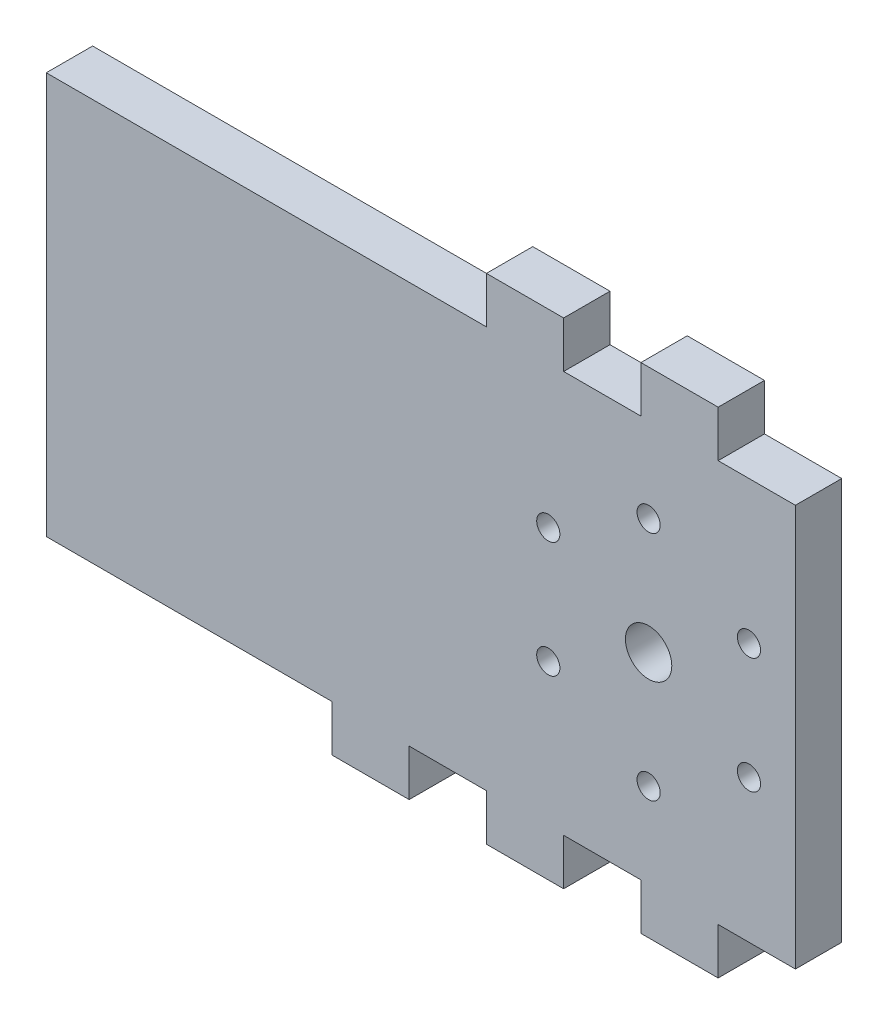
ISO-10303-21;
HEADER;
FILE_DESCRIPTION(('STEP AP214'),'2;1');
FILE_NAME('part.step','',(''),(''),'','','');
FILE_SCHEMA(('AUTOMOTIVE_DESIGN { 1 0 10303 214 1 1 1 1 }'));
ENDSEC;
DATA;
#1=APPLICATION_CONTEXT('core data for automotive mechanical design processes');
#2=APPLICATION_PROTOCOL_DEFINITION('international standard','automotive_design',2000,#1);
#3=PRODUCT_CONTEXT('',#1,'mechanical');
#4=PRODUCT('Part','Part','',(#3));
#5=PRODUCT_RELATED_PRODUCT_CATEGORY('part','',(#4));
#6=PRODUCT_DEFINITION_FORMATION('','',#4);
#7=PRODUCT_DEFINITION_CONTEXT('part definition',#1,'design');
#8=PRODUCT_DEFINITION('design','',#6,#7);
#9=PRODUCT_DEFINITION_SHAPE('','',#8);
#10=(LENGTH_UNIT() NAMED_UNIT(*) SI_UNIT(.MILLI.,.METRE.));
#11=(NAMED_UNIT(*) PLANE_ANGLE_UNIT() SI_UNIT($,.RADIAN.));
#12=(NAMED_UNIT(*) SI_UNIT($,.STERADIAN.) SOLID_ANGLE_UNIT());
#13=UNCERTAINTY_MEASURE_WITH_UNIT(LENGTH_MEASURE(1.E-05),#10,'distance_accuracy_value','');
#14=(GEOMETRIC_REPRESENTATION_CONTEXT(3) GLOBAL_UNCERTAINTY_ASSIGNED_CONTEXT((#13)) GLOBAL_UNIT_ASSIGNED_CONTEXT((#10,
#11,#12)) REPRESENTATION_CONTEXT('',''));
#15=CARTESIAN_POINT('',(0.,0.,0.));
#16=DIRECTION('',(0.,0.,1.));
#17=DIRECTION('',(1.,0.,0.));
#18=AXIS2_PLACEMENT_3D('',#15,#16,#17);
#19=CARTESIAN_POINT('',(0.,0.,3.));
#20=DIRECTION('',(0.,0.,-1.));
#21=DIRECTION('',(-1.,0.,0.));
#22=AXIS2_PLACEMENT_3D('',#19,#20,#21);
#23=PLANE('',#22);
#24=DIRECTION('',(1.,0.,0.));
#25=VECTOR('',#24,1.);
#26=CARTESIAN_POINT('',(25.,-26.,3.));
#27=LINE('',#26,#25);
#28=CARTESIAN_POINT('',(25.,-26.,3.));
#29=VERTEX_POINT('',#28);
#30=CARTESIAN_POINT('',(30.,-26.,3.));
#31=VERTEX_POINT('',#30);
#32=EDGE_CURVE('E274',#29,#31,#27,.T.);
#33=ORIENTED_EDGE('',*,*,#32,.T.);
#34=DIRECTION('',(0.,1.,0.));
#35=VECTOR('',#34,1.);
#36=CARTESIAN_POINT('',(30.,0.,3.));
#37=LINE('',#36,#35);
#38=CARTESIAN_POINT('',(30.,0.,3.));
#39=VERTEX_POINT('',#38);
#40=EDGE_CURVE('E141',#31,#39,#37,.T.);
#41=ORIENTED_EDGE('',*,*,#40,.T.);
#42=DIRECTION('',(-1.,0.,0.));
#43=VECTOR('',#42,1.);
#44=CARTESIAN_POINT('',(25.,0.,3.));
#45=LINE('',#44,#43);
#46=CARTESIAN_POINT('',(25.,0.,3.));
#47=VERTEX_POINT('',#46);
#48=EDGE_CURVE('E337',#39,#47,#45,.T.);
#49=ORIENTED_EDGE('',*,*,#48,.T.);
#50=DIRECTION('',(0.,1.,0.));
#51=VECTOR('',#50,1.);
#52=CARTESIAN_POINT('',(25.,2.99999999999994,3.));
#53=LINE('',#52,#51);
#54=CARTESIAN_POINT('',(25.,2.99999999999994,3.));
#55=VERTEX_POINT('',#54);
#56=EDGE_CURVE('E356',#47,#55,#53,.T.);
#57=ORIENTED_EDGE('',*,*,#56,.T.);
#58=DIRECTION('',(-1.,0.,0.));
#59=VECTOR('',#58,1.);
#60=CARTESIAN_POINT('',(20.,2.99999999999995,3.));
#61=LINE('',#60,#59);
#62=CARTESIAN_POINT('',(20.,2.99999999999995,3.));
#63=VERTEX_POINT('',#62);
#64=EDGE_CURVE('E353',#55,#63,#61,.T.);
#65=ORIENTED_EDGE('',*,*,#64,.T.);
#66=DIRECTION('',(0.,-1.,0.));
#67=VECTOR('',#66,1.);
#68=CARTESIAN_POINT('',(20.,0.,3.));
#69=LINE('',#68,#67);
#70=CARTESIAN_POINT('',(20.,0.,3.));
#71=VERTEX_POINT('',#70);
#72=EDGE_CURVE('E355',#63,#71,#69,.T.);
#73=ORIENTED_EDGE('',*,*,#72,.T.);
#74=DIRECTION('',(-1.,0.,0.));
#75=VECTOR('',#74,1.);
#76=CARTESIAN_POINT('',(14.9999999999999,0.,3.));
#77=LINE('',#76,#75);
#78=CARTESIAN_POINT('',(14.9999999999999,0.,3.));
#79=VERTEX_POINT('',#78);
#80=EDGE_CURVE('E358',#71,#79,#77,.T.);
#81=ORIENTED_EDGE('',*,*,#80,.T.);
#82=DIRECTION('',(0.,1.,0.));
#83=VECTOR('',#82,1.);
#84=CARTESIAN_POINT('',(14.9999999999999,2.99999999999994,3.));
#85=LINE('',#84,#83);
#86=CARTESIAN_POINT('',(14.9999999999999,2.99999999999994,3.));
#87=VERTEX_POINT('',#86);
#88=EDGE_CURVE('E364',#79,#87,#85,.T.);
#89=ORIENTED_EDGE('',*,*,#88,.T.);
#90=DIRECTION('',(-1.,0.,0.));
#91=VECTOR('',#90,1.);
#92=CARTESIAN_POINT('',(9.99999999999993,2.99999999999996,3.));
#93=LINE('',#92,#91);
#94=CARTESIAN_POINT('',(9.99999999999993,2.99999999999996,3.));
#95=VERTEX_POINT('',#94);
#96=EDGE_CURVE('E366',#87,#95,#93,.T.);
#97=ORIENTED_EDGE('',*,*,#96,.T.);
#98=DIRECTION('',(0.,-1.,0.));
#99=VECTOR('',#98,1.);
#100=CARTESIAN_POINT('',(9.99999999999994,0.,3.));
#101=LINE('',#100,#99);
#102=CARTESIAN_POINT('',(9.99999999999994,0.,3.));
#103=VERTEX_POINT('',#102);
#104=EDGE_CURVE('E368',#95,#103,#101,.T.);
#105=ORIENTED_EDGE('',*,*,#104,.T.);
#106=DIRECTION('',(-1.,0.,0.));
#107=VECTOR('',#106,1.);
#108=CARTESIAN_POINT('',(0.,0.,3.));
#109=LINE('',#108,#107);
#110=CARTESIAN_POINT('',(-18.49,-1.17961196366423E-13,3.));
#111=VERTEX_POINT('',#110);
#112=EDGE_CURVE('E370',#103,#111,#109,.T.);
#113=ORIENTED_EDGE('',*,*,#112,.T.);
#114=DIRECTION('',(0.,-1.,0.));
#115=VECTOR('',#114,1.);
#116=CARTESIAN_POINT('',(-18.49,-26.,3.));
#117=LINE('',#116,#115);
#118=CARTESIAN_POINT('',(-18.49,-26.,3.));
#119=VERTEX_POINT('',#118);
#120=EDGE_CURVE('E372',#111,#119,#117,.T.);
#121=ORIENTED_EDGE('',*,*,#120,.T.);
#122=DIRECTION('',(1.,0.,0.));
#123=VECTOR('',#122,1.);
#124=CARTESIAN_POINT('',(0.,-26.,3.));
#125=LINE('',#124,#123);
#126=CARTESIAN_POINT('',(0.,-26.,3.));
#127=VERTEX_POINT('',#126);
#128=EDGE_CURVE('E374',#119,#127,#125,.T.);
#129=ORIENTED_EDGE('',*,*,#128,.T.);
#130=DIRECTION('',(0.,-1.,0.));
#131=VECTOR('',#130,1.);
#132=CARTESIAN_POINT('',(0.,-26.,3.));
#133=LINE('',#132,#131);
#134=CARTESIAN_POINT('',(0.,-29.,3.));
#135=VERTEX_POINT('',#134);
#136=EDGE_CURVE('E376',#127,#135,#133,.T.);
#137=ORIENTED_EDGE('',*,*,#136,.T.);
#138=DIRECTION('',(1.,0.,0.));
#139=VECTOR('',#138,1.);
#140=CARTESIAN_POINT('',(0.,-29.,3.));
#141=LINE('',#140,#139);
#142=CARTESIAN_POINT('',(4.99999999999994,-29.,3.));
#143=VERTEX_POINT('',#142);
#144=EDGE_CURVE('E378',#135,#143,#141,.T.);
#145=ORIENTED_EDGE('',*,*,#144,.T.);
#146=DIRECTION('',(0.,1.,0.));
#147=VECTOR('',#146,1.);
#148=CARTESIAN_POINT('',(4.99999999999994,-29.,3.));
#149=LINE('',#148,#147);
#150=CARTESIAN_POINT('',(4.99999999999994,-26.,3.));
#151=VERTEX_POINT('',#150);
#152=EDGE_CURVE('E380',#143,#151,#149,.T.);
#153=ORIENTED_EDGE('',*,*,#152,.T.);
#154=DIRECTION('',(1.,0.,0.));
#155=VECTOR('',#154,1.);
#156=CARTESIAN_POINT('',(4.99999999999994,-26.,3.));
#157=LINE('',#156,#155);
#158=CARTESIAN_POINT('',(9.99999999999994,-26.,3.));
#159=VERTEX_POINT('',#158);
#160=EDGE_CURVE('E382',#151,#159,#157,.T.);
#161=ORIENTED_EDGE('',*,*,#160,.T.);
#162=DIRECTION('',(0.,-1.,0.));
#163=VECTOR('',#162,1.);
#164=CARTESIAN_POINT('',(9.99999999999994,-26.,3.));
#165=LINE('',#164,#163);
#166=CARTESIAN_POINT('',(9.99999999999995,-29.,3.));
#167=VERTEX_POINT('',#166);
#168=EDGE_CURVE('E384',#159,#167,#165,.T.);
#169=ORIENTED_EDGE('',*,*,#168,.T.);
#170=DIRECTION('',(1.,0.,0.));
#171=VECTOR('',#170,1.);
#172=CARTESIAN_POINT('',(9.99999999999995,-29.,3.));
#173=LINE('',#172,#171);
#174=CARTESIAN_POINT('',(14.9999999999999,-29.,3.));
#175=VERTEX_POINT('',#174);
#176=EDGE_CURVE('E386',#167,#175,#173,.T.);
#177=ORIENTED_EDGE('',*,*,#176,.T.);
#178=DIRECTION('',(0.,1.,0.));
#179=VECTOR('',#178,1.);
#180=CARTESIAN_POINT('',(14.9999999999999,-29.,3.));
#181=LINE('',#180,#179);
#182=CARTESIAN_POINT('',(15.,-26.,3.));
#183=VERTEX_POINT('',#182);
#184=EDGE_CURVE('E388',#175,#183,#181,.T.);
#185=ORIENTED_EDGE('',*,*,#184,.T.);
#186=DIRECTION('',(1.,0.,0.));
#187=VECTOR('',#186,1.);
#188=CARTESIAN_POINT('',(15.,-26.,3.));
#189=LINE('',#188,#187);
#190=CARTESIAN_POINT('',(20.,-26.,3.));
#191=VERTEX_POINT('',#190);
#192=EDGE_CURVE('E208',#183,#191,#189,.T.);
#193=ORIENTED_EDGE('',*,*,#192,.T.);
#194=DIRECTION('',(0.,-1.,0.));
#195=VECTOR('',#194,1.);
#196=CARTESIAN_POINT('',(20.,-29.,3.));
#197=LINE('',#196,#195);
#198=CARTESIAN_POINT('',(20.,-29.,3.));
#199=VERTEX_POINT('',#198);
#200=EDGE_CURVE('E202',#191,#199,#197,.T.);
#201=ORIENTED_EDGE('',*,*,#200,.T.);
#202=DIRECTION('',(1.,0.,0.));
#203=VECTOR('',#202,1.);
#204=CARTESIAN_POINT('',(20.,-29.,3.));
#205=LINE('',#204,#203);
#206=CARTESIAN_POINT('',(25.,-29.,3.));
#207=VERTEX_POINT('',#206);
#208=EDGE_CURVE('E206',#199,#207,#205,.T.);
#209=ORIENTED_EDGE('',*,*,#208,.T.);
#210=DIRECTION('',(0.,1.,0.));
#211=VECTOR('',#210,1.);
#212=CARTESIAN_POINT('',(25.,-29.,3.));
#213=LINE('',#212,#211);
#214=EDGE_CURVE('E50',#207,#29,#213,.T.);
#215=ORIENTED_EDGE('',*,*,#214,.T.);
#216=EDGE_LOOP('',(#33,#41,#49,#57,#65,#73,#81,#89,#97,#105,#113,#121,#129,#137,#145,#153,#161,
#169,#177,#185,#193,#201,#209,#215));
#217=FACE_BOUND('',#216,.T.);
#218=CARTESIAN_POINT('',(20.5,-5.50000000000007,3.));
#219=DIRECTION('',(0.,0.,1.));
#220=DIRECTION('',(1.,0.,0.));
#221=AXIS2_PLACEMENT_3D('',#218,#219,#220);
#222=CIRCLE('',#221,0.750000000000002);
#223=CARTESIAN_POINT('',(21.25,-5.50000000000007,3.));
#224=VERTEX_POINT('',#223);
#225=EDGE_CURVE('E230',#224,#224,#222,.T.);
#226=ORIENTED_EDGE('',*,*,#225,.F.);
#227=EDGE_LOOP('',(#226));
#228=FACE_BOUND('',#227,.T.);
#229=CARTESIAN_POINT('',(20.5,-13.0000000000001,3.));
#230=DIRECTION('',(0.,0.,1.));
#231=DIRECTION('',(1.,0.,0.));
#232=AXIS2_PLACEMENT_3D('',#229,#230,#231);
#233=CIRCLE('',#232,1.5);
#234=CARTESIAN_POINT('',(22.,-13.0000000000001,3.));
#235=VERTEX_POINT('',#234);
#236=EDGE_CURVE('E482',#235,#235,#233,.T.);
#237=ORIENTED_EDGE('',*,*,#236,.F.);
#238=EDGE_LOOP('',(#237));
#239=FACE_BOUND('',#238,.T.);
#240=CARTESIAN_POINT('',(26.9951905283833,-9.25000000000007,3.));
#241=DIRECTION('',(0.,0.,1.));
#242=DIRECTION('',(1.,0.,0.));
#243=AXIS2_PLACEMENT_3D('',#240,#241,#242);
#244=CIRCLE('',#243,0.750000000000002);
#245=CARTESIAN_POINT('',(27.7451905283833,-9.25000000000007,3.));
#246=VERTEX_POINT('',#245);
#247=EDGE_CURVE('E476',#246,#246,#244,.T.);
#248=ORIENTED_EDGE('',*,*,#247,.F.);
#249=EDGE_LOOP('',(#248));
#250=FACE_BOUND('',#249,.T.);
#251=CARTESIAN_POINT('',(26.9951905283833,-16.7500000000001,3.));
#252=DIRECTION('',(0.,0.,1.));
#253=DIRECTION('',(1.,0.,0.));
#254=AXIS2_PLACEMENT_3D('',#251,#252,#253);
#255=CIRCLE('',#254,0.750000000000005);
#256=CARTESIAN_POINT('',(27.7451905283833,-16.7500000000001,3.));
#257=VERTEX_POINT('',#256);
#258=EDGE_CURVE('E470',#257,#257,#255,.T.);
#259=ORIENTED_EDGE('',*,*,#258,.F.);
#260=EDGE_LOOP('',(#259));
#261=FACE_BOUND('',#260,.T.);
#262=CARTESIAN_POINT('',(20.5,-20.5000000000001,3.));
#263=DIRECTION('',(0.,0.,1.));
#264=DIRECTION('',(1.,0.,0.));
#265=AXIS2_PLACEMENT_3D('',#262,#263,#264);
#266=CIRCLE('',#265,0.750000000000002);
#267=CARTESIAN_POINT('',(21.25,-20.5000000000001,3.));
#268=VERTEX_POINT('',#267);
#269=EDGE_CURVE('E464',#268,#268,#266,.T.);
#270=ORIENTED_EDGE('',*,*,#269,.F.);
#271=EDGE_LOOP('',(#270));
#272=FACE_BOUND('',#271,.T.);
#273=CARTESIAN_POINT('',(14.0048094716167,-16.7500000000001,3.));
#274=DIRECTION('',(0.,0.,1.));
#275=DIRECTION('',(1.,0.,0.));
#276=AXIS2_PLACEMENT_3D('',#273,#274,#275);
#277=CIRCLE('',#276,0.750000000000002);
#278=CARTESIAN_POINT('',(14.7548094716167,-16.7500000000001,3.));
#279=VERTEX_POINT('',#278);
#280=EDGE_CURVE('E458',#279,#279,#277,.T.);
#281=ORIENTED_EDGE('',*,*,#280,.F.);
#282=EDGE_LOOP('',(#281));
#283=FACE_BOUND('',#282,.T.);
#284=CARTESIAN_POINT('',(14.0048094716167,-9.25000000000008,3.));
#285=DIRECTION('',(0.,0.,1.));
#286=DIRECTION('',(1.,0.,0.));
#287=AXIS2_PLACEMENT_3D('',#284,#285,#286);
#288=CIRCLE('',#287,0.750000000000002);
#289=CARTESIAN_POINT('',(14.7548094716167,-9.25000000000008,3.));
#290=VERTEX_POINT('',#289);
#291=EDGE_CURVE('E449',#290,#290,#288,.T.);
#292=ORIENTED_EDGE('',*,*,#291,.F.);
#293=EDGE_LOOP('',(#292));
#294=FACE_BOUND('',#293,.T.);
#295=ADVANCED_FACE('F33',(#217,#228,#239,#250,#261,#272,#283,#294),#23,.F.);
#296=CARTESIAN_POINT('',(0.,0.,0.));
#297=DIRECTION('',(0.,0.,-1.));
#298=DIRECTION('',(-1.,0.,0.));
#299=AXIS2_PLACEMENT_3D('',#296,#297,#298);
#300=PLANE('',#299);
#301=CARTESIAN_POINT('',(14.0048094716167,-16.7500000000001,0.));
#302=DIRECTION('',(0.,0.,1.));
#303=DIRECTION('',(1.,0.,0.));
#304=AXIS2_PLACEMENT_3D('',#301,#302,#303);
#305=CIRCLE('',#304,0.750000000000002);
#306=CARTESIAN_POINT('',(14.7548094716167,-16.7500000000001,0.));
#307=VERTEX_POINT('',#306);
#308=EDGE_CURVE('E455',#307,#307,#305,.T.);
#309=ORIENTED_EDGE('',*,*,#308,.T.);
#310=EDGE_LOOP('',(#309));
#311=FACE_BOUND('',#310,.T.);
#312=CARTESIAN_POINT('',(26.9951905283833,-16.7500000000001,0.));
#313=DIRECTION('',(0.,0.,1.));
#314=DIRECTION('',(1.,0.,0.));
#315=AXIS2_PLACEMENT_3D('',#312,#313,#314);
#316=CIRCLE('',#315,0.750000000000005);
#317=CARTESIAN_POINT('',(27.7451905283833,-16.7500000000001,0.));
#318=VERTEX_POINT('',#317);
#319=EDGE_CURVE('E467',#318,#318,#316,.T.);
#320=ORIENTED_EDGE('',*,*,#319,.T.);
#321=EDGE_LOOP('',(#320));
#322=FACE_BOUND('',#321,.T.);
#323=CARTESIAN_POINT('',(20.5,-13.0000000000001,0.));
#324=DIRECTION('',(0.,0.,1.));
#325=DIRECTION('',(1.,0.,0.));
#326=AXIS2_PLACEMENT_3D('',#323,#324,#325);
#327=CIRCLE('',#326,1.5);
#328=CARTESIAN_POINT('',(22.,-13.0000000000001,0.));
#329=VERTEX_POINT('',#328);
#330=EDGE_CURVE('E479',#329,#329,#327,.T.);
#331=ORIENTED_EDGE('',*,*,#330,.T.);
#332=EDGE_LOOP('',(#331));
#333=FACE_BOUND('',#332,.T.);
#334=DIRECTION('',(1.,0.,0.));
#335=VECTOR('',#334,1.);
#336=CARTESIAN_POINT('',(25.,-26.,0.));
#337=LINE('',#336,#335);
#338=CARTESIAN_POINT('',(25.,-26.,0.));
#339=VERTEX_POINT('',#338);
#340=CARTESIAN_POINT('',(30.,-26.,0.));
#341=VERTEX_POINT('',#340);
#342=EDGE_CURVE('E226',#339,#341,#337,.T.);
#343=ORIENTED_EDGE('',*,*,#342,.F.);
#344=DIRECTION('',(0.,1.,0.));
#345=VECTOR('',#344,1.);
#346=CARTESIAN_POINT('',(25.,-29.,0.));
#347=LINE('',#346,#345);
#348=CARTESIAN_POINT('',(25.,-29.,0.));
#349=VERTEX_POINT('',#348);
#350=EDGE_CURVE('E133',#349,#339,#347,.T.);
#351=ORIENTED_EDGE('',*,*,#350,.F.);
#352=DIRECTION('',(1.,0.,0.));
#353=VECTOR('',#352,1.);
#354=CARTESIAN_POINT('',(20.,-29.,0.));
#355=LINE('',#354,#353);
#356=CARTESIAN_POINT('',(20.,-29.,0.));
#357=VERTEX_POINT('',#356);
#358=EDGE_CURVE('E127',#357,#349,#355,.T.);
#359=ORIENTED_EDGE('',*,*,#358,.F.);
#360=DIRECTION('',(0.,-1.,0.));
#361=VECTOR('',#360,1.);
#362=CARTESIAN_POINT('',(20.,-29.,0.));
#363=LINE('',#362,#361);
#364=CARTESIAN_POINT('',(20.,-26.,0.));
#365=VERTEX_POINT('',#364);
#366=EDGE_CURVE('E216',#365,#357,#363,.T.);
#367=ORIENTED_EDGE('',*,*,#366,.F.);
#368=DIRECTION('',(1.,0.,0.));
#369=VECTOR('',#368,1.);
#370=CARTESIAN_POINT('',(15.,-26.,0.));
#371=LINE('',#370,#369);
#372=CARTESIAN_POINT('',(15.,-26.,0.));
#373=VERTEX_POINT('',#372);
#374=EDGE_CURVE('E269',#373,#365,#371,.T.);
#375=ORIENTED_EDGE('',*,*,#374,.F.);
#376=DIRECTION('',(0.,1.,0.));
#377=VECTOR('',#376,1.);
#378=CARTESIAN_POINT('',(14.9999999999999,-29.,0.));
#379=LINE('',#378,#377);
#380=CARTESIAN_POINT('',(14.9999999999999,-29.,0.));
#381=VERTEX_POINT('',#380);
#382=EDGE_CURVE('E267',#381,#373,#379,.T.);
#383=ORIENTED_EDGE('',*,*,#382,.F.);
#384=DIRECTION('',(1.,0.,0.));
#385=VECTOR('',#384,1.);
#386=CARTESIAN_POINT('',(9.99999999999995,-29.,0.));
#387=LINE('',#386,#385);
#388=CARTESIAN_POINT('',(9.99999999999995,-29.,0.));
#389=VERTEX_POINT('',#388);
#390=EDGE_CURVE('E265',#389,#381,#387,.T.);
#391=ORIENTED_EDGE('',*,*,#390,.F.);
#392=DIRECTION('',(0.,-1.,0.));
#393=VECTOR('',#392,1.);
#394=CARTESIAN_POINT('',(9.99999999999994,-26.,0.));
#395=LINE('',#394,#393);
#396=CARTESIAN_POINT('',(9.99999999999994,-26.,0.));
#397=VERTEX_POINT('',#396);
#398=EDGE_CURVE('E263',#397,#389,#395,.T.);
#399=ORIENTED_EDGE('',*,*,#398,.F.);
#400=DIRECTION('',(1.,0.,0.));
#401=VECTOR('',#400,1.);
#402=CARTESIAN_POINT('',(4.99999999999994,-26.,0.));
#403=LINE('',#402,#401);
#404=CARTESIAN_POINT('',(4.99999999999994,-26.,0.));
#405=VERTEX_POINT('',#404);
#406=EDGE_CURVE('E261',#405,#397,#403,.T.);
#407=ORIENTED_EDGE('',*,*,#406,.F.);
#408=DIRECTION('',(0.,1.,0.));
#409=VECTOR('',#408,1.);
#410=CARTESIAN_POINT('',(4.99999999999994,-29.,0.));
#411=LINE('',#410,#409);
#412=CARTESIAN_POINT('',(4.99999999999994,-29.,0.));
#413=VERTEX_POINT('',#412);
#414=EDGE_CURVE('E259',#413,#405,#411,.T.);
#415=ORIENTED_EDGE('',*,*,#414,.F.);
#416=DIRECTION('',(1.,0.,0.));
#417=VECTOR('',#416,1.);
#418=CARTESIAN_POINT('',(0.,-29.,0.));
#419=LINE('',#418,#417);
#420=CARTESIAN_POINT('',(0.,-29.,0.));
#421=VERTEX_POINT('',#420);
#422=EDGE_CURVE('E257',#421,#413,#419,.T.);
#423=ORIENTED_EDGE('',*,*,#422,.F.);
#424=DIRECTION('',(0.,-1.,0.));
#425=VECTOR('',#424,1.);
#426=CARTESIAN_POINT('',(0.,-26.,0.));
#427=LINE('',#426,#425);
#428=CARTESIAN_POINT('',(0.,-26.,0.));
#429=VERTEX_POINT('',#428);
#430=EDGE_CURVE('E255',#429,#421,#427,.T.);
#431=ORIENTED_EDGE('',*,*,#430,.F.);
#432=DIRECTION('',(1.,0.,0.));
#433=VECTOR('',#432,1.);
#434=CARTESIAN_POINT('',(0.,-26.,0.));
#435=LINE('',#434,#433);
#436=CARTESIAN_POINT('',(-18.49,-26.,0.));
#437=VERTEX_POINT('',#436);
#438=EDGE_CURVE('E253',#437,#429,#435,.T.);
#439=ORIENTED_EDGE('',*,*,#438,.F.);
#440=DIRECTION('',(0.,-1.,0.));
#441=VECTOR('',#440,1.);
#442=CARTESIAN_POINT('',(-18.49,-26.,0.));
#443=LINE('',#442,#441);
#444=CARTESIAN_POINT('',(-18.49,-1.17961196366423E-13,0.));
#445=VERTEX_POINT('',#444);
#446=EDGE_CURVE('E251',#445,#437,#443,.T.);
#447=ORIENTED_EDGE('',*,*,#446,.F.);
#448=DIRECTION('',(-1.,0.,0.));
#449=VECTOR('',#448,1.);
#450=CARTESIAN_POINT('',(-18.49,-1.17961196366423E-13,0.));
#451=LINE('',#450,#449);
#452=CARTESIAN_POINT('',(9.99999999999994,0.,0.));
#453=VERTEX_POINT('',#452);
#454=EDGE_CURVE('E249',#453,#445,#451,.T.);
#455=ORIENTED_EDGE('',*,*,#454,.F.);
#456=DIRECTION('',(0.,-1.,0.));
#457=VECTOR('',#456,1.);
#458=CARTESIAN_POINT('',(9.99999999999994,0.,0.));
#459=LINE('',#458,#457);
#460=CARTESIAN_POINT('',(9.99999999999993,2.99999999999996,0.));
#461=VERTEX_POINT('',#460);
#462=EDGE_CURVE('E246',#461,#453,#459,.T.);
#463=ORIENTED_EDGE('',*,*,#462,.F.);
#464=DIRECTION('',(-1.,0.,0.));
#465=VECTOR('',#464,1.);
#466=CARTESIAN_POINT('',(9.99999999999993,2.99999999999996,0.));
#467=LINE('',#466,#465);
#468=CARTESIAN_POINT('',(14.9999999999999,2.99999999999994,0.));
#469=VERTEX_POINT('',#468);
#470=EDGE_CURVE('E244',#469,#461,#467,.T.);
#471=ORIENTED_EDGE('',*,*,#470,.F.);
#472=DIRECTION('',(0.,1.,0.));
#473=VECTOR('',#472,1.);
#474=CARTESIAN_POINT('',(14.9999999999999,2.99999999999994,0.));
#475=LINE('',#474,#473);
#476=CARTESIAN_POINT('',(14.9999999999999,0.,0.));
#477=VERTEX_POINT('',#476);
#478=EDGE_CURVE('E242',#477,#469,#475,.T.);
#479=ORIENTED_EDGE('',*,*,#478,.F.);
#480=DIRECTION('',(-1.,0.,0.));
#481=VECTOR('',#480,1.);
#482=CARTESIAN_POINT('',(14.9999999999999,0.,0.));
#483=LINE('',#482,#481);
#484=CARTESIAN_POINT('',(20.,0.,0.));
#485=VERTEX_POINT('',#484);
#486=EDGE_CURVE('E240',#485,#477,#483,.T.);
#487=ORIENTED_EDGE('',*,*,#486,.F.);
#488=DIRECTION('',(0.,-1.,0.));
#489=VECTOR('',#488,1.);
#490=CARTESIAN_POINT('',(20.,0.,0.));
#491=LINE('',#490,#489);
#492=CARTESIAN_POINT('',(20.,2.99999999999995,0.));
#493=VERTEX_POINT('',#492);
#494=EDGE_CURVE('E238',#493,#485,#491,.T.);
#495=ORIENTED_EDGE('',*,*,#494,.F.);
#496=DIRECTION('',(-1.,0.,0.));
#497=VECTOR('',#496,1.);
#498=CARTESIAN_POINT('',(20.,2.99999999999995,0.));
#499=LINE('',#498,#497);
#500=CARTESIAN_POINT('',(25.,2.99999999999994,0.));
#501=VERTEX_POINT('',#500);
#502=EDGE_CURVE('E236',#501,#493,#499,.T.);
#503=ORIENTED_EDGE('',*,*,#502,.F.);
#504=DIRECTION('',(0.,1.,0.));
#505=VECTOR('',#504,1.);
#506=CARTESIAN_POINT('',(25.,2.99999999999994,0.));
#507=LINE('',#506,#505);
#508=CARTESIAN_POINT('',(25.,0.,0.));
#509=VERTEX_POINT('',#508);
#510=EDGE_CURVE('E234',#509,#501,#507,.T.);
#511=ORIENTED_EDGE('',*,*,#510,.F.);
#512=DIRECTION('',(-1.,0.,0.));
#513=VECTOR('',#512,1.);
#514=CARTESIAN_POINT('',(25.,0.,0.));
#515=LINE('',#514,#513);
#516=CARTESIAN_POINT('',(30.,0.,0.));
#517=VERTEX_POINT('',#516);
#518=EDGE_CURVE('E232',#517,#509,#515,.T.);
#519=ORIENTED_EDGE('',*,*,#518,.F.);
#520=DIRECTION('',(0.,1.,0.));
#521=VECTOR('',#520,1.);
#522=CARTESIAN_POINT('',(30.,0.,0.));
#523=LINE('',#522,#521);
#524=EDGE_CURVE('E229',#341,#517,#523,.T.);
#525=ORIENTED_EDGE('',*,*,#524,.F.);
#526=EDGE_LOOP('',(#343,#351,#359,#367,#375,#383,#391,#399,#407,#415,#423,#431,#439,#447,#455,
#463,#471,#479,#487,#495,#503,#511,#519,#525));
#527=FACE_BOUND('',#526,.T.);
#528=CARTESIAN_POINT('',(20.5,-5.50000000000007,0.));
#529=DIRECTION('',(0.,0.,1.));
#530=DIRECTION('',(1.,0.,0.));
#531=AXIS2_PLACEMENT_3D('',#528,#529,#530);
#532=CIRCLE('',#531,0.750000000000002);
#533=CARTESIAN_POINT('',(21.25,-5.50000000000007,0.));
#534=VERTEX_POINT('',#533);
#535=EDGE_CURVE('E485',#534,#534,#532,.T.);
#536=ORIENTED_EDGE('',*,*,#535,.T.);
#537=EDGE_LOOP('',(#536));
#538=FACE_BOUND('',#537,.T.);
#539=CARTESIAN_POINT('',(26.9951905283833,-9.25000000000007,0.));
#540=DIRECTION('',(0.,0.,1.));
#541=DIRECTION('',(1.,0.,0.));
#542=AXIS2_PLACEMENT_3D('',#539,#540,#541);
#543=CIRCLE('',#542,0.750000000000002);
#544=CARTESIAN_POINT('',(27.7451905283833,-9.25000000000007,0.));
#545=VERTEX_POINT('',#544);
#546=EDGE_CURVE('E473',#545,#545,#543,.T.);
#547=ORIENTED_EDGE('',*,*,#546,.T.);
#548=EDGE_LOOP('',(#547));
#549=FACE_BOUND('',#548,.T.);
#550=CARTESIAN_POINT('',(20.5,-20.5000000000001,0.));
#551=DIRECTION('',(0.,0.,1.));
#552=DIRECTION('',(1.,0.,0.));
#553=AXIS2_PLACEMENT_3D('',#550,#551,#552);
#554=CIRCLE('',#553,0.750000000000002);
#555=CARTESIAN_POINT('',(21.25,-20.5000000000001,0.));
#556=VERTEX_POINT('',#555);
#557=EDGE_CURVE('E461',#556,#556,#554,.T.);
#558=ORIENTED_EDGE('',*,*,#557,.T.);
#559=EDGE_LOOP('',(#558));
#560=FACE_BOUND('',#559,.T.);
#561=CARTESIAN_POINT('',(14.0048094716167,-9.25000000000008,0.));
#562=DIRECTION('',(0.,0.,1.));
#563=DIRECTION('',(1.,0.,0.));
#564=AXIS2_PLACEMENT_3D('',#561,#562,#563);
#565=CIRCLE('',#564,0.750000000000002);
#566=CARTESIAN_POINT('',(14.7548094716167,-9.25000000000008,0.));
#567=VERTEX_POINT('',#566);
#568=EDGE_CURVE('E452',#567,#567,#565,.T.);
#569=ORIENTED_EDGE('',*,*,#568,.T.);
#570=EDGE_LOOP('',(#569));
#571=FACE_BOUND('',#570,.T.);
#572=ADVANCED_FACE('F341',(#311,#322,#333,#527,#538,#549,#560,#571),#300,.T.);
#573=CARTESIAN_POINT('',(25.,-26.,3.));
#574=DIRECTION('',(0.,1.,0.));
#575=DIRECTION('',(-1.,0.,0.));
#576=AXIS2_PLACEMENT_3D('',#573,#574,#575);
#577=PLANE('',#576);
#578=ORIENTED_EDGE('',*,*,#342,.T.);
#579=DIRECTION('',(0.,0.,-1.));
#580=VECTOR('',#579,1.);
#581=CARTESIAN_POINT('',(30.,-26.,3.));
#582=LINE('',#581,#580);
#583=EDGE_CURVE('E11',#31,#341,#582,.T.);
#584=ORIENTED_EDGE('',*,*,#583,.F.);
#585=ORIENTED_EDGE('',*,*,#32,.F.);
#586=DIRECTION('',(0.,0.,-1.));
#587=VECTOR('',#586,1.);
#588=CARTESIAN_POINT('',(25.,-26.,3.));
#589=LINE('',#588,#587);
#590=EDGE_CURVE('E222',#29,#339,#589,.T.);
#591=ORIENTED_EDGE('',*,*,#590,.T.);
#592=EDGE_LOOP('',(#578,#584,#585,#591));
#593=FACE_BOUND('',#592,.T.);
#594=ADVANCED_FACE('F35',(#593),#577,.F.);
#595=CARTESIAN_POINT('',(30.,0.,3.));
#596=DIRECTION('',(-1.,0.,0.));
#597=DIRECTION('',(0.,-1.,0.));
#598=AXIS2_PLACEMENT_3D('',#595,#596,#597);
#599=PLANE('',#598);
#600=ORIENTED_EDGE('',*,*,#524,.T.);
#601=DIRECTION('',(0.,0.,-1.));
#602=VECTOR('',#601,1.);
#603=CARTESIAN_POINT('',(30.,0.,3.));
#604=LINE('',#603,#602);
#605=EDGE_CURVE('E42',#39,#517,#604,.T.);
#606=ORIENTED_EDGE('',*,*,#605,.F.);
#607=ORIENTED_EDGE('',*,*,#40,.F.);
#608=ORIENTED_EDGE('',*,*,#583,.T.);
#609=EDGE_LOOP('',(#600,#606,#607,#608));
#610=FACE_BOUND('',#609,.T.);
#611=ADVANCED_FACE('F745',(#610),#599,.F.);
#612=CARTESIAN_POINT('',(25.,0.,3.));
#613=DIRECTION('',(0.,-1.,0.));
#614=DIRECTION('',(1.,0.,0.));
#615=AXIS2_PLACEMENT_3D('',#612,#613,#614);
#616=PLANE('',#615);
#617=ORIENTED_EDGE('',*,*,#518,.T.);
#618=DIRECTION('',(0.,0.,-1.));
#619=VECTOR('',#618,1.);
#620=CARTESIAN_POINT('',(25.,0.,3.));
#621=LINE('',#620,#619);
#622=EDGE_CURVE('E329',#47,#509,#621,.T.);
#623=ORIENTED_EDGE('',*,*,#622,.F.);
#624=ORIENTED_EDGE('',*,*,#48,.F.);
#625=ORIENTED_EDGE('',*,*,#605,.T.);
#626=EDGE_LOOP('',(#617,#623,#624,#625));
#627=FACE_BOUND('',#626,.T.);
#628=ADVANCED_FACE('F335',(#627),#616,.F.);
#629=CARTESIAN_POINT('',(25.,2.99999999999994,3.));
#630=DIRECTION('',(-1.,0.,0.));
#631=DIRECTION('',(0.,-1.,0.));
#632=AXIS2_PLACEMENT_3D('',#629,#630,#631);
#633=PLANE('',#632);
#634=ORIENTED_EDGE('',*,*,#510,.T.);
#635=DIRECTION('',(0.,0.,-1.));
#636=VECTOR('',#635,1.);
#637=CARTESIAN_POINT('',(25.,2.99999999999994,3.));
#638=LINE('',#637,#636);
#639=EDGE_CURVE('E326',#55,#501,#638,.T.);
#640=ORIENTED_EDGE('',*,*,#639,.F.);
#641=ORIENTED_EDGE('',*,*,#56,.F.);
#642=ORIENTED_EDGE('',*,*,#622,.T.);
#643=EDGE_LOOP('',(#634,#640,#641,#642));
#644=FACE_BOUND('',#643,.T.);
#645=ADVANCED_FACE('F347',(#644),#633,.F.);
#646=CARTESIAN_POINT('',(20.,2.99999999999995,3.));
#647=DIRECTION('',(0.,-1.,0.));
#648=DIRECTION('',(1.,0.,0.));
#649=AXIS2_PLACEMENT_3D('',#646,#647,#648);
#650=PLANE('',#649);
#651=ORIENTED_EDGE('',*,*,#502,.T.);
#652=DIRECTION('',(0.,0.,-1.));
#653=VECTOR('',#652,1.);
#654=CARTESIAN_POINT('',(20.,2.99999999999995,3.));
#655=LINE('',#654,#653);
#656=EDGE_CURVE('E323',#63,#493,#655,.T.);
#657=ORIENTED_EDGE('',*,*,#656,.F.);
#658=ORIENTED_EDGE('',*,*,#64,.F.);
#659=ORIENTED_EDGE('',*,*,#639,.T.);
#660=EDGE_LOOP('',(#651,#657,#658,#659));
#661=FACE_BOUND('',#660,.T.);
#662=ADVANCED_FACE('F351',(#661),#650,.F.);
#663=CARTESIAN_POINT('',(20.,0.,3.));
#664=DIRECTION('',(1.,0.,0.));
#665=DIRECTION('',(0.,0.,-1.));
#666=AXIS2_PLACEMENT_3D('',#663,#664,#665);
#667=PLANE('',#666);
#668=ORIENTED_EDGE('',*,*,#494,.T.);
#669=DIRECTION('',(0.,0.,-1.));
#670=VECTOR('',#669,1.);
#671=CARTESIAN_POINT('',(20.,0.,3.));
#672=LINE('',#671,#670);
#673=EDGE_CURVE('E320',#71,#485,#672,.T.);
#674=ORIENTED_EDGE('',*,*,#673,.F.);
#675=ORIENTED_EDGE('',*,*,#72,.F.);
#676=ORIENTED_EDGE('',*,*,#656,.T.);
#677=EDGE_LOOP('',(#668,#674,#675,#676));
#678=FACE_BOUND('',#677,.T.);
#679=ADVANCED_FACE('F710',(#678),#667,.F.);
#680=CARTESIAN_POINT('',(14.9999999999999,0.,3.));
#681=DIRECTION('',(0.,-1.,0.));
#682=DIRECTION('',(1.,0.,0.));
#683=AXIS2_PLACEMENT_3D('',#680,#681,#682);
#684=PLANE('',#683);
#685=ORIENTED_EDGE('',*,*,#486,.T.);
#686=DIRECTION('',(0.,0.,-1.));
#687=VECTOR('',#686,1.);
#688=CARTESIAN_POINT('',(14.9999999999999,0.,3.));
#689=LINE('',#688,#687);
#690=EDGE_CURVE('E317',#79,#477,#689,.T.);
#691=ORIENTED_EDGE('',*,*,#690,.F.);
#692=ORIENTED_EDGE('',*,*,#80,.F.);
#693=ORIENTED_EDGE('',*,*,#673,.T.);
#694=EDGE_LOOP('',(#685,#691,#692,#693));
#695=FACE_BOUND('',#694,.T.);
#696=ADVANCED_FACE('F700',(#695),#684,.F.);
#697=CARTESIAN_POINT('',(14.9999999999999,2.99999999999994,3.));
#698=DIRECTION('',(-1.,0.,0.));
#699=DIRECTION('',(0.,-1.,0.));
#700=AXIS2_PLACEMENT_3D('',#697,#698,#699);
#701=PLANE('',#700);
#702=ORIENTED_EDGE('',*,*,#478,.T.);
#703=DIRECTION('',(0.,0.,-1.));
#704=VECTOR('',#703,1.);
#705=CARTESIAN_POINT('',(14.9999999999999,2.99999999999994,3.));
#706=LINE('',#705,#704);
#707=EDGE_CURVE('E314',#87,#469,#706,.T.);
#708=ORIENTED_EDGE('',*,*,#707,.F.);
#709=ORIENTED_EDGE('',*,*,#88,.F.);
#710=ORIENTED_EDGE('',*,*,#690,.T.);
#711=EDGE_LOOP('',(#702,#708,#709,#710));
#712=FACE_BOUND('',#711,.T.);
#713=ADVANCED_FACE('F690',(#712),#701,.F.);
#714=CARTESIAN_POINT('',(9.99999999999993,2.99999999999996,3.));
#715=DIRECTION('',(0.,-1.,0.));
#716=DIRECTION('',(1.,0.,0.));
#717=AXIS2_PLACEMENT_3D('',#714,#715,#716);
#718=PLANE('',#717);
#719=ORIENTED_EDGE('',*,*,#470,.T.);
#720=DIRECTION('',(0.,0.,-1.));
#721=VECTOR('',#720,1.);
#722=CARTESIAN_POINT('',(9.99999999999993,2.99999999999996,3.));
#723=LINE('',#722,#721);
#724=EDGE_CURVE('E311',#95,#461,#723,.T.);
#725=ORIENTED_EDGE('',*,*,#724,.F.);
#726=ORIENTED_EDGE('',*,*,#96,.F.);
#727=ORIENTED_EDGE('',*,*,#707,.T.);
#728=EDGE_LOOP('',(#719,#725,#726,#727));
#729=FACE_BOUND('',#728,.T.);
#730=ADVANCED_FACE('F680',(#729),#718,.F.);
#731=CARTESIAN_POINT('',(9.99999999999994,0.,3.));
#732=DIRECTION('',(1.,0.,0.));
#733=DIRECTION('',(0.,1.,0.));
#734=AXIS2_PLACEMENT_3D('',#731,#732,#733);
#735=PLANE('',#734);
#736=ORIENTED_EDGE('',*,*,#462,.T.);
#737=DIRECTION('',(0.,0.,-1.));
#738=VECTOR('',#737,1.);
#739=CARTESIAN_POINT('',(9.99999999999994,0.,3.));
#740=LINE('',#739,#738);
#741=EDGE_CURVE('E308',#103,#453,#740,.T.);
#742=ORIENTED_EDGE('',*,*,#741,.F.);
#743=ORIENTED_EDGE('',*,*,#104,.F.);
#744=ORIENTED_EDGE('',*,*,#724,.T.);
#745=EDGE_LOOP('',(#736,#742,#743,#744));
#746=FACE_BOUND('',#745,.T.);
#747=ADVANCED_FACE('F669',(#746),#735,.F.);
#748=CARTESIAN_POINT('',(-18.49,-1.17961196366423E-13,3.));
#749=DIRECTION('',(0.,-1.,0.));
#750=DIRECTION('',(1.,0.,0.));
#751=AXIS2_PLACEMENT_3D('',#748,#749,#750);
#752=PLANE('',#751);
#753=ORIENTED_EDGE('',*,*,#454,.T.);
#754=DIRECTION('',(0.,0.,-1.));
#755=VECTOR('',#754,1.);
#756=CARTESIAN_POINT('',(-18.49,-1.17961196366423E-13,3.));
#757=LINE('',#756,#755);
#758=EDGE_CURVE('E305',#111,#445,#757,.T.);
#759=ORIENTED_EDGE('',*,*,#758,.F.);
#760=ORIENTED_EDGE('',*,*,#112,.F.);
#761=ORIENTED_EDGE('',*,*,#741,.T.);
#762=EDGE_LOOP('',(#753,#759,#760,#761));
#763=FACE_BOUND('',#762,.T.);
#764=ADVANCED_FACE('F659',(#763),#752,.F.);
#765=CARTESIAN_POINT('',(-18.49,-26.,3.));
#766=DIRECTION('',(1.,0.,0.));
#767=DIRECTION('',(0.,0.,-1.));
#768=AXIS2_PLACEMENT_3D('',#765,#766,#767);
#769=PLANE('',#768);
#770=ORIENTED_EDGE('',*,*,#446,.T.);
#771=DIRECTION('',(0.,0.,-1.));
#772=VECTOR('',#771,1.);
#773=CARTESIAN_POINT('',(-18.49,-26.,3.));
#774=LINE('',#773,#772);
#775=EDGE_CURVE('E302',#119,#437,#774,.T.);
#776=ORIENTED_EDGE('',*,*,#775,.F.);
#777=ORIENTED_EDGE('',*,*,#120,.F.);
#778=ORIENTED_EDGE('',*,*,#758,.T.);
#779=EDGE_LOOP('',(#770,#776,#777,#778));
#780=FACE_BOUND('',#779,.T.);
#781=ADVANCED_FACE('F649',(#780),#769,.F.);
#782=CARTESIAN_POINT('',(0.,-26.,3.));
#783=DIRECTION('',(0.,1.,0.));
#784=DIRECTION('',(-1.,0.,0.));
#785=AXIS2_PLACEMENT_3D('',#782,#783,#784);
#786=PLANE('',#785);
#787=ORIENTED_EDGE('',*,*,#438,.T.);
#788=DIRECTION('',(0.,0.,-1.));
#789=VECTOR('',#788,1.);
#790=CARTESIAN_POINT('',(0.,-26.,3.));
#791=LINE('',#790,#789);
#792=EDGE_CURVE('E299',#127,#429,#791,.T.);
#793=ORIENTED_EDGE('',*,*,#792,.F.);
#794=ORIENTED_EDGE('',*,*,#128,.F.);
#795=ORIENTED_EDGE('',*,*,#775,.T.);
#796=EDGE_LOOP('',(#787,#793,#794,#795));
#797=FACE_BOUND('',#796,.T.);
#798=ADVANCED_FACE('F639',(#797),#786,.F.);
#799=CARTESIAN_POINT('',(0.,-26.,3.));
#800=DIRECTION('',(1.,0.,0.));
#801=DIRECTION('',(0.,1.,0.));
#802=AXIS2_PLACEMENT_3D('',#799,#800,#801);
#803=PLANE('',#802);
#804=ORIENTED_EDGE('',*,*,#430,.T.);
#805=DIRECTION('',(0.,0.,-1.));
#806=VECTOR('',#805,1.);
#807=CARTESIAN_POINT('',(0.,-29.,3.));
#808=LINE('',#807,#806);
#809=EDGE_CURVE('E296',#135,#421,#808,.T.);
#810=ORIENTED_EDGE('',*,*,#809,.F.);
#811=ORIENTED_EDGE('',*,*,#136,.F.);
#812=ORIENTED_EDGE('',*,*,#792,.T.);
#813=EDGE_LOOP('',(#804,#810,#811,#812));
#814=FACE_BOUND('',#813,.T.);
#815=ADVANCED_FACE('F629',(#814),#803,.F.);
#816=CARTESIAN_POINT('',(0.,-29.,3.));
#817=DIRECTION('',(0.,1.,0.));
#818=DIRECTION('',(0.,0.,1.));
#819=AXIS2_PLACEMENT_3D('',#816,#817,#818);
#820=PLANE('',#819);
#821=ORIENTED_EDGE('',*,*,#422,.T.);
#822=DIRECTION('',(0.,0.,-1.));
#823=VECTOR('',#822,1.);
#824=CARTESIAN_POINT('',(4.99999999999994,-29.,3.));
#825=LINE('',#824,#823);
#826=EDGE_CURVE('E293',#143,#413,#825,.T.);
#827=ORIENTED_EDGE('',*,*,#826,.F.);
#828=ORIENTED_EDGE('',*,*,#144,.F.);
#829=ORIENTED_EDGE('',*,*,#809,.T.);
#830=EDGE_LOOP('',(#821,#827,#828,#829));
#831=FACE_BOUND('',#830,.T.);
#832=ADVANCED_FACE('F619',(#831),#820,.F.);
#833=CARTESIAN_POINT('',(4.99999999999994,-29.,3.));
#834=DIRECTION('',(-1.,0.,0.));
#835=DIRECTION('',(0.,0.,1.));
#836=AXIS2_PLACEMENT_3D('',#833,#834,#835);
#837=PLANE('',#836);
#838=ORIENTED_EDGE('',*,*,#414,.T.);
#839=DIRECTION('',(0.,0.,-1.));
#840=VECTOR('',#839,1.);
#841=CARTESIAN_POINT('',(4.99999999999994,-26.,3.));
#842=LINE('',#841,#840);
#843=EDGE_CURVE('E290',#151,#405,#842,.T.);
#844=ORIENTED_EDGE('',*,*,#843,.F.);
#845=ORIENTED_EDGE('',*,*,#152,.F.);
#846=ORIENTED_EDGE('',*,*,#826,.T.);
#847=EDGE_LOOP('',(#838,#844,#845,#846));
#848=FACE_BOUND('',#847,.T.);
#849=ADVANCED_FACE('F609',(#848),#837,.F.);
#850=CARTESIAN_POINT('',(4.99999999999994,-26.,3.));
#851=DIRECTION('',(0.,1.,0.));
#852=DIRECTION('',(-1.,0.,0.));
#853=AXIS2_PLACEMENT_3D('',#850,#851,#852);
#854=PLANE('',#853);
#855=ORIENTED_EDGE('',*,*,#406,.T.);
#856=DIRECTION('',(0.,0.,-1.));
#857=VECTOR('',#856,1.);
#858=CARTESIAN_POINT('',(9.99999999999994,-26.,3.));
#859=LINE('',#858,#857);
#860=EDGE_CURVE('E287',#159,#397,#859,.T.);
#861=ORIENTED_EDGE('',*,*,#860,.F.);
#862=ORIENTED_EDGE('',*,*,#160,.F.);
#863=ORIENTED_EDGE('',*,*,#843,.T.);
#864=EDGE_LOOP('',(#855,#861,#862,#863));
#865=FACE_BOUND('',#864,.T.);
#866=ADVANCED_FACE('F599',(#865),#854,.F.);
#867=CARTESIAN_POINT('',(9.99999999999994,-26.,3.));
#868=DIRECTION('',(1.,0.,0.));
#869=DIRECTION('',(0.,1.,0.));
#870=AXIS2_PLACEMENT_3D('',#867,#868,#869);
#871=PLANE('',#870);
#872=ORIENTED_EDGE('',*,*,#398,.T.);
#873=DIRECTION('',(0.,0.,-1.));
#874=VECTOR('',#873,1.);
#875=CARTESIAN_POINT('',(9.99999999999995,-29.,3.));
#876=LINE('',#875,#874);
#877=EDGE_CURVE('E284',#167,#389,#876,.T.);
#878=ORIENTED_EDGE('',*,*,#877,.F.);
#879=ORIENTED_EDGE('',*,*,#168,.F.);
#880=ORIENTED_EDGE('',*,*,#860,.T.);
#881=EDGE_LOOP('',(#872,#878,#879,#880));
#882=FACE_BOUND('',#881,.T.);
#883=ADVANCED_FACE('F589',(#882),#871,.F.);
#884=CARTESIAN_POINT('',(9.99999999999995,-29.,3.));
#885=DIRECTION('',(0.,1.,0.));
#886=DIRECTION('',(0.,0.,1.));
#887=AXIS2_PLACEMENT_3D('',#884,#885,#886);
#888=PLANE('',#887);
#889=ORIENTED_EDGE('',*,*,#390,.T.);
#890=DIRECTION('',(0.,0.,-1.));
#891=VECTOR('',#890,1.);
#892=CARTESIAN_POINT('',(14.9999999999999,-29.,3.));
#893=LINE('',#892,#891);
#894=EDGE_CURVE('E281',#175,#381,#893,.T.);
#895=ORIENTED_EDGE('',*,*,#894,.F.);
#896=ORIENTED_EDGE('',*,*,#176,.F.);
#897=ORIENTED_EDGE('',*,*,#877,.T.);
#898=EDGE_LOOP('',(#889,#895,#896,#897));
#899=FACE_BOUND('',#898,.T.);
#900=ADVANCED_FACE('F580',(#899),#888,.F.);
#901=CARTESIAN_POINT('',(14.9999999999999,-29.,3.));
#902=DIRECTION('',(-1.,0.,0.));
#903=DIRECTION('',(0.,-1.,0.));
#904=AXIS2_PLACEMENT_3D('',#901,#902,#903);
#905=PLANE('',#904);
#906=ORIENTED_EDGE('',*,*,#382,.T.);
#907=DIRECTION('',(0.,0.,-1.));
#908=VECTOR('',#907,1.);
#909=CARTESIAN_POINT('',(15.,-26.,3.));
#910=LINE('',#909,#908);
#911=EDGE_CURVE('E278',#183,#373,#910,.T.);
#912=ORIENTED_EDGE('',*,*,#911,.F.);
#913=ORIENTED_EDGE('',*,*,#184,.F.);
#914=ORIENTED_EDGE('',*,*,#894,.T.);
#915=EDGE_LOOP('',(#906,#912,#913,#914));
#916=FACE_BOUND('',#915,.T.);
#917=ADVANCED_FACE('F394',(#916),#905,.F.);
#918=CARTESIAN_POINT('',(15.,-26.,3.));
#919=DIRECTION('',(0.,1.,0.));
#920=DIRECTION('',(-1.,0.,0.));
#921=AXIS2_PLACEMENT_3D('',#918,#919,#920);
#922=PLANE('',#921);
#923=ORIENTED_EDGE('',*,*,#374,.T.);
#924=DIRECTION('',(0.,0.,-1.));
#925=VECTOR('',#924,1.);
#926=CARTESIAN_POINT('',(20.,-26.,3.));
#927=LINE('',#926,#925);
#928=EDGE_CURVE('E217',#191,#365,#927,.T.);
#929=ORIENTED_EDGE('',*,*,#928,.F.);
#930=ORIENTED_EDGE('',*,*,#192,.F.);
#931=ORIENTED_EDGE('',*,*,#911,.T.);
#932=EDGE_LOOP('',(#923,#929,#930,#931));
#933=FACE_BOUND('',#932,.T.);
#934=ADVANCED_FACE('F398',(#933),#922,.F.);
#935=CARTESIAN_POINT('',(20.,-29.,3.));
#936=DIRECTION('',(1.,0.,0.));
#937=DIRECTION('',(0.,1.,0.));
#938=AXIS2_PLACEMENT_3D('',#935,#936,#937);
#939=PLANE('',#938);
#940=ORIENTED_EDGE('',*,*,#366,.T.);
#941=DIRECTION('',(0.,0.,-1.));
#942=VECTOR('',#941,1.);
#943=CARTESIAN_POINT('',(20.,-29.,3.));
#944=LINE('',#943,#942);
#945=EDGE_CURVE('E213',#199,#357,#944,.T.);
#946=ORIENTED_EDGE('',*,*,#945,.F.);
#947=ORIENTED_EDGE('',*,*,#200,.F.);
#948=ORIENTED_EDGE('',*,*,#928,.T.);
#949=EDGE_LOOP('',(#940,#946,#947,#948));
#950=FACE_BOUND('',#949,.T.);
#951=ADVANCED_FACE('F214',(#950),#939,.F.);
#952=CARTESIAN_POINT('',(20.,-29.,3.));
#953=DIRECTION('',(0.,1.,0.));
#954=DIRECTION('',(-1.,0.,0.));
#955=AXIS2_PLACEMENT_3D('',#952,#953,#954);
#956=PLANE('',#955);
#957=ORIENTED_EDGE('',*,*,#358,.T.);
#958=DIRECTION('',(0.,0.,-1.));
#959=VECTOR('',#958,1.);
#960=CARTESIAN_POINT('',(25.,-29.,3.));
#961=LINE('',#960,#959);
#962=EDGE_CURVE('E218',#207,#349,#961,.T.);
#963=ORIENTED_EDGE('',*,*,#962,.F.);
#964=ORIENTED_EDGE('',*,*,#208,.F.);
#965=ORIENTED_EDGE('',*,*,#945,.T.);
#966=EDGE_LOOP('',(#957,#963,#964,#965));
#967=FACE_BOUND('',#966,.T.);
#968=ADVANCED_FACE('F220',(#967),#956,.F.);
#969=CARTESIAN_POINT('',(25.,-29.,3.));
#970=DIRECTION('',(-1.,0.,0.));
#971=DIRECTION('',(0.,-1.,0.));
#972=AXIS2_PLACEMENT_3D('',#969,#970,#971);
#973=PLANE('',#972);
#974=ORIENTED_EDGE('',*,*,#350,.T.);
#975=ORIENTED_EDGE('',*,*,#590,.F.);
#976=ORIENTED_EDGE('',*,*,#214,.F.);
#977=ORIENTED_EDGE('',*,*,#962,.T.);
#978=EDGE_LOOP('',(#974,#975,#976,#977));
#979=FACE_BOUND('',#978,.T.);
#980=ADVANCED_FACE('F402',(#979),#973,.F.);
#981=CARTESIAN_POINT('',(20.5,-5.50000000000007,3.));
#982=DIRECTION('',(0.,0.,-1.));
#983=DIRECTION('',(-1.,0.,0.));
#984=AXIS2_PLACEMENT_3D('',#981,#982,#983);
#985=CYLINDRICAL_SURFACE('',#984,0.750000000000002);
#986=ORIENTED_EDGE('',*,*,#225,.T.);
#987=EDGE_LOOP('',(#986));
#988=FACE_BOUND('',#987,.T.);
#989=ORIENTED_EDGE('',*,*,#535,.F.);
#990=EDGE_LOOP('',(#989));
#991=FACE_BOUND('',#990,.T.);
#992=ADVANCED_FACE('F404',(#988,#991),#985,.F.);
#993=CARTESIAN_POINT('',(20.5,-13.0000000000001,3.));
#994=DIRECTION('',(0.,0.,-1.));
#995=DIRECTION('',(-1.,0.,0.));
#996=AXIS2_PLACEMENT_3D('',#993,#994,#995);
#997=CYLINDRICAL_SURFACE('',#996,1.5);
#998=ORIENTED_EDGE('',*,*,#236,.T.);
#999=EDGE_LOOP('',(#998));
#1000=FACE_BOUND('',#999,.T.);
#1001=ORIENTED_EDGE('',*,*,#330,.F.);
#1002=EDGE_LOOP('',(#1001));
#1003=FACE_BOUND('',#1002,.T.);
#1004=ADVANCED_FACE('F410',(#1000,#1003),#997,.F.);
#1005=CARTESIAN_POINT('',(26.9951905283833,-9.25000000000007,3.));
#1006=DIRECTION('',(0.,0.,-1.));
#1007=DIRECTION('',(-1.,0.,0.));
#1008=AXIS2_PLACEMENT_3D('',#1005,#1006,#1007);
#1009=CYLINDRICAL_SURFACE('',#1008,0.750000000000002);
#1010=ORIENTED_EDGE('',*,*,#247,.T.);
#1011=EDGE_LOOP('',(#1010));
#1012=FACE_BOUND('',#1011,.T.);
#1013=ORIENTED_EDGE('',*,*,#546,.F.);
#1014=EDGE_LOOP('',(#1013));
#1015=FACE_BOUND('',#1014,.T.);
#1016=ADVANCED_FACE('F424',(#1012,#1015),#1009,.F.);
#1017=CARTESIAN_POINT('',(26.9951905283833,-16.7500000000001,3.));
#1018=DIRECTION('',(0.,0.,-1.));
#1019=DIRECTION('',(-1.,0.,0.));
#1020=AXIS2_PLACEMENT_3D('',#1017,#1018,#1019);
#1021=CYLINDRICAL_SURFACE('',#1020,0.750000000000005);
#1022=ORIENTED_EDGE('',*,*,#258,.T.);
#1023=EDGE_LOOP('',(#1022));
#1024=FACE_BOUND('',#1023,.T.);
#1025=ORIENTED_EDGE('',*,*,#319,.F.);
#1026=EDGE_LOOP('',(#1025));
#1027=FACE_BOUND('',#1026,.T.);
#1028=ADVANCED_FACE('F428',(#1024,#1027),#1021,.F.);
#1029=CARTESIAN_POINT('',(20.5,-20.5000000000001,3.));
#1030=DIRECTION('',(0.,0.,-1.));
#1031=DIRECTION('',(-1.,0.,0.));
#1032=AXIS2_PLACEMENT_3D('',#1029,#1030,#1031);
#1033=CYLINDRICAL_SURFACE('',#1032,0.750000000000002);
#1034=ORIENTED_EDGE('',*,*,#269,.T.);
#1035=EDGE_LOOP('',(#1034));
#1036=FACE_BOUND('',#1035,.T.);
#1037=ORIENTED_EDGE('',*,*,#557,.F.);
#1038=EDGE_LOOP('',(#1037));
#1039=FACE_BOUND('',#1038,.T.);
#1040=ADVANCED_FACE('F432',(#1036,#1039),#1033,.F.);
#1041=CARTESIAN_POINT('',(14.0048094716167,-16.7500000000001,3.));
#1042=DIRECTION('',(0.,0.,-1.));
#1043=DIRECTION('',(-1.,0.,0.));
#1044=AXIS2_PLACEMENT_3D('',#1041,#1042,#1043);
#1045=CYLINDRICAL_SURFACE('',#1044,0.750000000000002);
#1046=ORIENTED_EDGE('',*,*,#280,.T.);
#1047=EDGE_LOOP('',(#1046));
#1048=FACE_BOUND('',#1047,.T.);
#1049=ORIENTED_EDGE('',*,*,#308,.F.);
#1050=EDGE_LOOP('',(#1049));
#1051=FACE_BOUND('',#1050,.T.);
#1052=ADVANCED_FACE('F436',(#1048,#1051),#1045,.F.);
#1053=CARTESIAN_POINT('',(14.0048094716167,-9.25000000000008,3.));
#1054=DIRECTION('',(0.,0.,-1.));
#1055=DIRECTION('',(-1.,0.,0.));
#1056=AXIS2_PLACEMENT_3D('',#1053,#1054,#1055);
#1057=CYLINDRICAL_SURFACE('',#1056,0.750000000000002);
#1058=ORIENTED_EDGE('',*,*,#291,.T.);
#1059=EDGE_LOOP('',(#1058));
#1060=FACE_BOUND('',#1059,.T.);
#1061=ORIENTED_EDGE('',*,*,#568,.F.);
#1062=EDGE_LOOP('',(#1061));
#1063=FACE_BOUND('',#1062,.T.);
#1064=ADVANCED_FACE('F440',(#1060,#1063),#1057,.F.);
#1065=CLOSED_SHELL('',(#295,#572,#594,#611,#628,#645,#662,#679,#696,#713,#730,#747,#764,#781,
#798,#815,#832,#849,#866,#883,#900,#917,#934,#951,#968,#980,#992,#1004,#1016,#1028,#1040,#1052,#1064));
#1066=MANIFOLD_SOLID_BREP('B2',#1065);
#1067=ADVANCED_BREP_SHAPE_REPRESENTATION('',(#18,#1066),#14);
#1068=SHAPE_DEFINITION_REPRESENTATION(#9,#1067);
ENDSEC;
END-ISO-10303-21;
